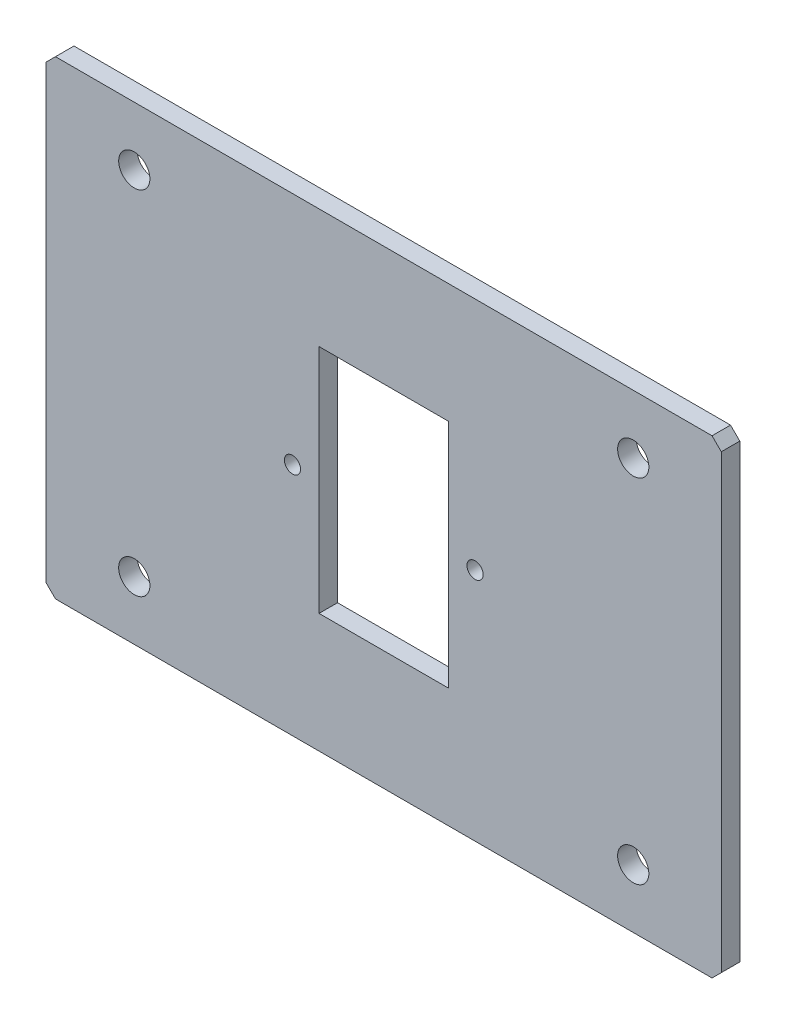
ISO-10303-21;
HEADER;
FILE_DESCRIPTION(('STEP AP214'),'2;1');
FILE_NAME('part.step','',(''),(''),'','','');
FILE_SCHEMA(('AUTOMOTIVE_DESIGN { 1 0 10303 214 1 1 1 1 }'));
ENDSEC;
DATA;
#1=APPLICATION_CONTEXT('core data for automotive mechanical design processes');
#2=APPLICATION_PROTOCOL_DEFINITION('international standard','automotive_design',2000,#1);
#3=PRODUCT_CONTEXT('',#1,'mechanical');
#4=PRODUCT('Part','Part','',(#3));
#5=PRODUCT_RELATED_PRODUCT_CATEGORY('part','',(#4));
#6=PRODUCT_DEFINITION_FORMATION('','',#4);
#7=PRODUCT_DEFINITION_CONTEXT('part definition',#1,'design');
#8=PRODUCT_DEFINITION('design','',#6,#7);
#9=PRODUCT_DEFINITION_SHAPE('','',#8);
#10=(LENGTH_UNIT() NAMED_UNIT(*) SI_UNIT(.MILLI.,.METRE.));
#11=(NAMED_UNIT(*) PLANE_ANGLE_UNIT() SI_UNIT($,.RADIAN.));
#12=(NAMED_UNIT(*) SI_UNIT($,.STERADIAN.) SOLID_ANGLE_UNIT());
#13=UNCERTAINTY_MEASURE_WITH_UNIT(LENGTH_MEASURE(1.E-05),#10,'distance_accuracy_value','');
#14=(GEOMETRIC_REPRESENTATION_CONTEXT(3) GLOBAL_UNCERTAINTY_ASSIGNED_CONTEXT((#13)) GLOBAL_UNIT_ASSIGNED_CONTEXT((#10,
#11,#12)) REPRESENTATION_CONTEXT('',''));
#15=CARTESIAN_POINT('',(0.,0.,0.));
#16=DIRECTION('',(0.,0.,1.));
#17=DIRECTION('',(1.,0.,0.));
#18=AXIS2_PLACEMENT_3D('',#15,#16,#17);
#19=CARTESIAN_POINT('',(0.,-50.8,4.));
#20=DIRECTION('',(0.,1.,0.));
#21=DIRECTION('',(0.,0.,1.));
#22=AXIS2_PLACEMENT_3D('',#19,#20,#21);
#23=PLANE('',#22);
#24=DIRECTION('',(1.,0.,0.));
#25=VECTOR('',#24,1.);
#26=CARTESIAN_POINT('',(0.,-50.8,0.));
#27=LINE('',#26,#25);
#28=CARTESIAN_POINT('',(-71.025,-50.8,0.));
#29=VERTEX_POINT('',#28);
#30=CARTESIAN_POINT('',(71.0249999999999,-50.8,0.));
#31=VERTEX_POINT('',#30);
#32=EDGE_CURVE('E268',#29,#31,#27,.T.);
#33=ORIENTED_EDGE('',*,*,#32,.T.);
#34=DIRECTION('',(0.,0.,1.));
#35=VECTOR('',#34,1.);
#36=CARTESIAN_POINT('',(71.0249999999999,-50.8,4.));
#37=LINE('',#36,#35);
#38=CARTESIAN_POINT('',(71.0249999999999,-50.8,4.));
#39=VERTEX_POINT('',#38);
#40=EDGE_CURVE('E219',#31,#39,#37,.T.);
#41=ORIENTED_EDGE('',*,*,#40,.T.);
#42=DIRECTION('',(1.,0.,0.));
#43=VECTOR('',#42,1.);
#44=CARTESIAN_POINT('',(0.,-50.8,4.));
#45=LINE('',#44,#43);
#46=CARTESIAN_POINT('',(-71.025,-50.8,4.));
#47=VERTEX_POINT('',#46);
#48=EDGE_CURVE('E298',#47,#39,#45,.T.);
#49=ORIENTED_EDGE('',*,*,#48,.F.);
#50=DIRECTION('',(0.,0.,-1.));
#51=VECTOR('',#50,1.);
#52=CARTESIAN_POINT('',(-71.025,-50.8,0.));
#53=LINE('',#52,#51);
#54=EDGE_CURVE('E215',#47,#29,#53,.T.);
#55=ORIENTED_EDGE('',*,*,#54,.T.);
#56=EDGE_LOOP('',(#33,#41,#49,#55));
#57=FACE_BOUND('',#56,.T.);
#58=ADVANCED_FACE('F41',(#57),#23,.F.);
#59=CARTESIAN_POINT('',(73.0249999999999,0.,4.));
#60=DIRECTION('',(-1.,0.,0.));
#61=DIRECTION('',(0.,0.,1.));
#62=AXIS2_PLACEMENT_3D('',#59,#60,#61);
#63=PLANE('',#62);
#64=DIRECTION('',(0.,1.,0.));
#65=VECTOR('',#64,1.);
#66=CARTESIAN_POINT('',(73.0249999999999,0.,0.));
#67=LINE('',#66,#65);
#68=CARTESIAN_POINT('',(73.0249999999999,-48.8,0.));
#69=VERTEX_POINT('',#68);
#70=CARTESIAN_POINT('',(73.0249999999999,48.8,0.));
#71=VERTEX_POINT('',#70);
#72=EDGE_CURVE('E241',#69,#71,#67,.T.);
#73=ORIENTED_EDGE('',*,*,#72,.T.);
#74=DIRECTION('',(0.,0.,1.));
#75=VECTOR('',#74,1.);
#76=CARTESIAN_POINT('',(73.0249999999999,48.8,4.));
#77=LINE('',#76,#75);
#78=CARTESIAN_POINT('',(73.0249999999999,48.8,4.));
#79=VERTEX_POINT('',#78);
#80=EDGE_CURVE('E201',#71,#79,#77,.T.);
#81=ORIENTED_EDGE('',*,*,#80,.T.);
#82=DIRECTION('',(0.,1.,0.));
#83=VECTOR('',#82,1.);
#84=CARTESIAN_POINT('',(73.0249999999999,0.,4.));
#85=LINE('',#84,#83);
#86=CARTESIAN_POINT('',(73.0249999999999,-48.8,4.));
#87=VERTEX_POINT('',#86);
#88=EDGE_CURVE('E289',#87,#79,#85,.T.);
#89=ORIENTED_EDGE('',*,*,#88,.F.);
#90=DIRECTION('',(0.,0.,-1.));
#91=VECTOR('',#90,1.);
#92=CARTESIAN_POINT('',(73.0249999999999,-48.8,4.));
#93=LINE('',#92,#91);
#94=EDGE_CURVE('E197',#87,#69,#93,.T.);
#95=ORIENTED_EDGE('',*,*,#94,.T.);
#96=EDGE_LOOP('',(#73,#81,#89,#95));
#97=FACE_BOUND('',#96,.T.);
#98=ADVANCED_FACE('F279',(#97),#63,.F.);
#99=CARTESIAN_POINT('',(0.,50.8,4.));
#100=DIRECTION('',(0.,1.,0.));
#101=DIRECTION('',(0.,0.,1.));
#102=AXIS2_PLACEMENT_3D('',#99,#100,#101);
#103=PLANE('',#102);
#104=DIRECTION('',(1.,0.,0.));
#105=VECTOR('',#104,1.);
#106=CARTESIAN_POINT('',(0.,50.8,4.));
#107=LINE('',#106,#105);
#108=CARTESIAN_POINT('',(-71.025,50.8,4.));
#109=VERTEX_POINT('',#108);
#110=CARTESIAN_POINT('',(71.025,50.8,4.));
#111=VERTEX_POINT('',#110);
#112=EDGE_CURVE('E288',#109,#111,#107,.T.);
#113=ORIENTED_EDGE('',*,*,#112,.T.);
#114=DIRECTION('',(0.,0.,-1.));
#115=VECTOR('',#114,1.);
#116=CARTESIAN_POINT('',(71.025,50.8,0.));
#117=LINE('',#116,#115);
#118=CARTESIAN_POINT('',(71.025,50.8,0.));
#119=VERTEX_POINT('',#118);
#120=EDGE_CURVE('E165',#111,#119,#117,.T.);
#121=ORIENTED_EDGE('',*,*,#120,.T.);
#122=DIRECTION('',(1.,0.,0.));
#123=VECTOR('',#122,1.);
#124=CARTESIAN_POINT('',(0.,50.8,0.));
#125=LINE('',#124,#123);
#126=CARTESIAN_POINT('',(-71.025,50.8,0.));
#127=VERTEX_POINT('',#126);
#128=EDGE_CURVE('E235',#127,#119,#125,.T.);
#129=ORIENTED_EDGE('',*,*,#128,.F.);
#130=DIRECTION('',(0.,0.,1.));
#131=VECTOR('',#130,1.);
#132=CARTESIAN_POINT('',(-71.025,50.8,4.));
#133=LINE('',#132,#131);
#134=EDGE_CURVE('E161',#127,#109,#133,.T.);
#135=ORIENTED_EDGE('',*,*,#134,.T.);
#136=EDGE_LOOP('',(#113,#121,#129,#135));
#137=FACE_BOUND('',#136,.T.);
#138=ADVANCED_FACE('F291',(#137),#103,.T.);
#139=CARTESIAN_POINT('',(-14.,0.,4.));
#140=DIRECTION('',(-1.,0.,0.));
#141=DIRECTION('',(0.,0.,1.));
#142=AXIS2_PLACEMENT_3D('',#139,#140,#141);
#143=PLANE('',#142);
#144=DIRECTION('',(0.,1.,0.));
#145=VECTOR('',#144,1.);
#146=CARTESIAN_POINT('',(-14.,0.,0.));
#147=LINE('',#146,#145);
#148=CARTESIAN_POINT('',(-14.,-25.,0.));
#149=VERTEX_POINT('',#148);
#150=CARTESIAN_POINT('',(-14.,25.,0.));
#151=VERTEX_POINT('',#150);
#152=EDGE_CURVE('E159',#149,#151,#147,.T.);
#153=ORIENTED_EDGE('',*,*,#152,.T.);
#154=DIRECTION('',(0.,0.,-1.));
#155=VECTOR('',#154,1.);
#156=CARTESIAN_POINT('',(-14.,25.,4.));
#157=LINE('',#156,#155);
#158=CARTESIAN_POINT('',(-14.,25.,4.));
#159=VERTEX_POINT('',#158);
#160=EDGE_CURVE('E137',#159,#151,#157,.T.);
#161=ORIENTED_EDGE('',*,*,#160,.F.);
#162=DIRECTION('',(0.,1.,0.));
#163=VECTOR('',#162,1.);
#164=CARTESIAN_POINT('',(-14.,0.,4.));
#165=LINE('',#164,#163);
#166=CARTESIAN_POINT('',(-14.,-25.,4.));
#167=VERTEX_POINT('',#166);
#168=EDGE_CURVE('E145',#167,#159,#165,.T.);
#169=ORIENTED_EDGE('',*,*,#168,.F.);
#170=DIRECTION('',(0.,0.,-1.));
#171=VECTOR('',#170,1.);
#172=CARTESIAN_POINT('',(-14.,-25.,4.));
#173=LINE('',#172,#171);
#174=EDGE_CURVE('E245',#167,#149,#173,.T.);
#175=ORIENTED_EDGE('',*,*,#174,.T.);
#176=EDGE_LOOP('',(#153,#161,#169,#175));
#177=FACE_BOUND('',#176,.T.);
#178=ADVANCED_FACE('F157',(#177),#143,.F.);
#179=CARTESIAN_POINT('',(0.,25.,4.));
#180=DIRECTION('',(0.,1.,0.));
#181=DIRECTION('',(0.,0.,1.));
#182=AXIS2_PLACEMENT_3D('',#179,#180,#181);
#183=PLANE('',#182);
#184=DIRECTION('',(1.,0.,0.));
#185=VECTOR('',#184,1.);
#186=CARTESIAN_POINT('',(0.,25.,0.));
#187=LINE('',#186,#185);
#188=CARTESIAN_POINT('',(14.,25.,0.));
#189=VERTEX_POINT('',#188);
#190=EDGE_CURVE('E260',#151,#189,#187,.T.);
#191=ORIENTED_EDGE('',*,*,#190,.T.);
#192=DIRECTION('',(0.,0.,-1.));
#193=VECTOR('',#192,1.);
#194=CARTESIAN_POINT('',(14.,25.,4.));
#195=LINE('',#194,#193);
#196=CARTESIAN_POINT('',(14.,25.,4.));
#197=VERTEX_POINT('',#196);
#198=EDGE_CURVE('E139',#197,#189,#195,.T.);
#199=ORIENTED_EDGE('',*,*,#198,.F.);
#200=DIRECTION('',(1.,0.,0.));
#201=VECTOR('',#200,1.);
#202=CARTESIAN_POINT('',(0.,25.,4.));
#203=LINE('',#202,#201);
#204=EDGE_CURVE('E132',#159,#197,#203,.T.);
#205=ORIENTED_EDGE('',*,*,#204,.F.);
#206=ORIENTED_EDGE('',*,*,#160,.T.);
#207=EDGE_LOOP('',(#191,#199,#205,#206));
#208=FACE_BOUND('',#207,.T.);
#209=ADVANCED_FACE('F135',(#208),#183,.F.);
#210=CARTESIAN_POINT('',(14.,0.,4.));
#211=DIRECTION('',(-1.,0.,0.));
#212=DIRECTION('',(0.,0.,1.));
#213=AXIS2_PLACEMENT_3D('',#210,#211,#212);
#214=PLANE('',#213);
#215=DIRECTION('',(0.,1.,0.));
#216=VECTOR('',#215,1.);
#217=CARTESIAN_POINT('',(14.,0.,0.));
#218=LINE('',#217,#216);
#219=CARTESIAN_POINT('',(14.,-25.,0.));
#220=VERTEX_POINT('',#219);
#221=EDGE_CURVE('E256',#220,#189,#218,.T.);
#222=ORIENTED_EDGE('',*,*,#221,.F.);
#223=DIRECTION('',(0.,0.,-1.));
#224=VECTOR('',#223,1.);
#225=CARTESIAN_POINT('',(14.,-25.,4.));
#226=LINE('',#225,#224);
#227=CARTESIAN_POINT('',(14.,-25.,4.));
#228=VERTEX_POINT('',#227);
#229=EDGE_CURVE('E167',#228,#220,#226,.T.);
#230=ORIENTED_EDGE('',*,*,#229,.F.);
#231=DIRECTION('',(0.,1.,0.));
#232=VECTOR('',#231,1.);
#233=CARTESIAN_POINT('',(14.,0.,4.));
#234=LINE('',#233,#232);
#235=EDGE_CURVE('E144',#228,#197,#234,.T.);
#236=ORIENTED_EDGE('',*,*,#235,.T.);
#237=ORIENTED_EDGE('',*,*,#198,.T.);
#238=EDGE_LOOP('',(#222,#230,#236,#237));
#239=FACE_BOUND('',#238,.T.);
#240=ADVANCED_FACE('F257',(#239),#214,.T.);
#241=CARTESIAN_POINT('',(-19.75,0.,4.));
#242=DIRECTION('',(0.,0.,-1.));
#243=DIRECTION('',(-1.,0.,0.));
#244=AXIS2_PLACEMENT_3D('',#241,#242,#243);
#245=CYLINDRICAL_SURFACE('',#244,1.75);
#246=CARTESIAN_POINT('',(-19.75,0.,4.));
#247=DIRECTION('',(0.,0.,1.));
#248=DIRECTION('',(1.,0.,0.));
#249=AXIS2_PLACEMENT_3D('',#246,#247,#248);
#250=CIRCLE('',#249,1.75);
#251=CARTESIAN_POINT('',(-18.,0.,4.));
#252=VERTEX_POINT('',#251);
#253=EDGE_CURVE('E336',#252,#252,#250,.T.);
#254=ORIENTED_EDGE('',*,*,#253,.T.);
#255=EDGE_LOOP('',(#254));
#256=FACE_BOUND('',#255,.T.);
#257=CARTESIAN_POINT('',(-19.75,0.,0.));
#258=DIRECTION('',(0.,0.,1.));
#259=DIRECTION('',(1.,0.,0.));
#260=AXIS2_PLACEMENT_3D('',#257,#258,#259);
#261=CIRCLE('',#260,1.75);
#262=CARTESIAN_POINT('',(-18.,0.,0.));
#263=VERTEX_POINT('',#262);
#264=EDGE_CURVE('E264',#263,#263,#261,.T.);
#265=ORIENTED_EDGE('',*,*,#264,.F.);
#266=EDGE_LOOP('',(#265));
#267=FACE_BOUND('',#266,.T.);
#268=ADVANCED_FACE('F366',(#256,#267),#245,.F.);
#269=CARTESIAN_POINT('',(0.,-25.,4.));
#270=DIRECTION('',(0.,1.,0.));
#271=DIRECTION('',(0.,0.,1.));
#272=AXIS2_PLACEMENT_3D('',#269,#270,#271);
#273=PLANE('',#272);
#274=DIRECTION('',(1.,0.,0.));
#275=VECTOR('',#274,1.);
#276=CARTESIAN_POINT('',(0.,-25.,0.));
#277=LINE('',#276,#275);
#278=EDGE_CURVE('E253',#149,#220,#277,.T.);
#279=ORIENTED_EDGE('',*,*,#278,.F.);
#280=ORIENTED_EDGE('',*,*,#174,.F.);
#281=DIRECTION('',(1.,0.,0.));
#282=VECTOR('',#281,1.);
#283=CARTESIAN_POINT('',(0.,-25.,4.));
#284=LINE('',#283,#282);
#285=EDGE_CURVE('E152',#167,#228,#284,.T.);
#286=ORIENTED_EDGE('',*,*,#285,.T.);
#287=ORIENTED_EDGE('',*,*,#229,.T.);
#288=EDGE_LOOP('',(#279,#280,#286,#287));
#289=FACE_BOUND('',#288,.T.);
#290=ADVANCED_FACE('F251',(#289),#273,.T.);
#291=CARTESIAN_POINT('',(19.75,0.,4.));
#292=DIRECTION('',(0.,0.,-1.));
#293=DIRECTION('',(-1.,0.,0.));
#294=AXIS2_PLACEMENT_3D('',#291,#292,#293);
#295=CYLINDRICAL_SURFACE('',#294,1.75);
#296=CARTESIAN_POINT('',(19.75,0.,4.));
#297=DIRECTION('',(0.,0.,1.));
#298=DIRECTION('',(1.,0.,0.));
#299=AXIS2_PLACEMENT_3D('',#296,#297,#298);
#300=CIRCLE('',#299,1.75);
#301=CARTESIAN_POINT('',(21.5,0.,4.));
#302=VERTEX_POINT('',#301);
#303=EDGE_CURVE('E155',#302,#302,#300,.T.);
#304=ORIENTED_EDGE('',*,*,#303,.T.);
#305=EDGE_LOOP('',(#304));
#306=FACE_BOUND('',#305,.T.);
#307=CARTESIAN_POINT('',(19.75,0.,0.));
#308=DIRECTION('',(0.,0.,1.));
#309=DIRECTION('',(1.,0.,0.));
#310=AXIS2_PLACEMENT_3D('',#307,#308,#309);
#311=CIRCLE('',#310,1.75);
#312=CARTESIAN_POINT('',(21.5,0.,0.));
#313=VERTEX_POINT('',#312);
#314=EDGE_CURVE('E302',#313,#313,#311,.T.);
#315=ORIENTED_EDGE('',*,*,#314,.F.);
#316=EDGE_LOOP('',(#315));
#317=FACE_BOUND('',#316,.T.);
#318=ADVANCED_FACE('F372',(#306,#317),#295,.F.);
#319=CARTESIAN_POINT('',(-73.025,0.,4.));
#320=DIRECTION('',(-1.,0.,0.));
#321=DIRECTION('',(0.,0.,1.));
#322=AXIS2_PLACEMENT_3D('',#319,#320,#321);
#323=PLANE('',#322);
#324=DIRECTION('',(0.,1.,0.));
#325=VECTOR('',#324,1.);
#326=CARTESIAN_POINT('',(-73.025,0.,0.));
#327=LINE('',#326,#325);
#328=CARTESIAN_POINT('',(-73.025,-48.8,0.));
#329=VERTEX_POINT('',#328);
#330=CARTESIAN_POINT('',(-73.025,48.8,0.));
#331=VERTEX_POINT('',#330);
#332=EDGE_CURVE('E226',#329,#331,#327,.T.);
#333=ORIENTED_EDGE('',*,*,#332,.F.);
#334=DIRECTION('',(0.,0.,1.));
#335=VECTOR('',#334,1.);
#336=CARTESIAN_POINT('',(-73.025,-48.8,4.));
#337=LINE('',#336,#335);
#338=CARTESIAN_POINT('',(-73.025,-48.8,4.));
#339=VERTEX_POINT('',#338);
#340=EDGE_CURVE('E11',#329,#339,#337,.T.);
#341=ORIENTED_EDGE('',*,*,#340,.T.);
#342=DIRECTION('',(0.,1.,0.));
#343=VECTOR('',#342,1.);
#344=CARTESIAN_POINT('',(-73.025,0.,4.));
#345=LINE('',#344,#343);
#346=CARTESIAN_POINT('',(-73.025,48.8,4.));
#347=VERTEX_POINT('',#346);
#348=EDGE_CURVE('E227',#339,#347,#345,.T.);
#349=ORIENTED_EDGE('',*,*,#348,.T.);
#350=DIRECTION('',(0.,0.,-1.));
#351=VECTOR('',#350,1.);
#352=CARTESIAN_POINT('',(-73.025,48.8,4.));
#353=LINE('',#352,#351);
#354=EDGE_CURVE('E51',#347,#331,#353,.T.);
#355=ORIENTED_EDGE('',*,*,#354,.T.);
#356=EDGE_LOOP('',(#333,#341,#349,#355));
#357=FACE_BOUND('',#356,.T.);
#358=ADVANCED_FACE('F225',(#357),#323,.T.);
#359=CARTESIAN_POINT('',(0.,0.,4.));
#360=DIRECTION('',(0.,0.,1.));
#361=DIRECTION('',(1.,0.,0.));
#362=AXIS2_PLACEMENT_3D('',#359,#360,#361);
#363=PLANE('',#362);
#364=CARTESIAN_POINT('',(-53.975,38.1,4.));
#365=DIRECTION('',(0.,0.,1.));
#366=DIRECTION('',(1.,0.,0.));
#367=AXIS2_PLACEMENT_3D('',#364,#365,#366);
#368=CIRCLE('',#367,3.37819999999999);
#369=CARTESIAN_POINT('',(-50.5968,38.1,4.));
#370=VERTEX_POINT('',#369);
#371=EDGE_CURVE('E325',#370,#370,#368,.T.);
#372=ORIENTED_EDGE('',*,*,#371,.F.);
#373=EDGE_LOOP('',(#372));
#374=FACE_BOUND('',#373,.T.);
#375=CARTESIAN_POINT('',(53.9749999999999,38.1,4.));
#376=DIRECTION('',(0.,0.,1.));
#377=DIRECTION('',(1.,0.,0.));
#378=AXIS2_PLACEMENT_3D('',#375,#376,#377);
#379=CIRCLE('',#378,3.37819999999999);
#380=CARTESIAN_POINT('',(57.3531999999999,38.1,4.));
#381=VERTEX_POINT('',#380);
#382=EDGE_CURVE('E180',#381,#381,#379,.T.);
#383=ORIENTED_EDGE('',*,*,#382,.F.);
#384=EDGE_LOOP('',(#383));
#385=FACE_BOUND('',#384,.T.);
#386=CARTESIAN_POINT('',(53.9749999999999,-38.1,4.));
#387=DIRECTION('',(0.,0.,1.));
#388=DIRECTION('',(1.,0.,0.));
#389=AXIS2_PLACEMENT_3D('',#386,#387,#388);
#390=CIRCLE('',#389,3.37819999999999);
#391=CARTESIAN_POINT('',(57.3531999999999,-38.1,4.));
#392=VERTEX_POINT('',#391);
#393=EDGE_CURVE('E176',#392,#392,#390,.T.);
#394=ORIENTED_EDGE('',*,*,#393,.F.);
#395=EDGE_LOOP('',(#394));
#396=FACE_BOUND('',#395,.T.);
#397=CARTESIAN_POINT('',(-53.975,-38.1,4.));
#398=DIRECTION('',(0.,0.,1.));
#399=DIRECTION('',(1.,0.,0.));
#400=AXIS2_PLACEMENT_3D('',#397,#398,#399);
#401=CIRCLE('',#400,3.37819999999999);
#402=CARTESIAN_POINT('',(-50.5968,-38.1,4.));
#403=VERTEX_POINT('',#402);
#404=EDGE_CURVE('E175',#403,#403,#401,.T.);
#405=ORIENTED_EDGE('',*,*,#404,.F.);
#406=EDGE_LOOP('',(#405));
#407=FACE_BOUND('',#406,.T.);
#408=ORIENTED_EDGE('',*,*,#303,.F.);
#409=EDGE_LOOP('',(#408));
#410=FACE_BOUND('',#409,.T.);
#411=ORIENTED_EDGE('',*,*,#168,.T.);
#412=ORIENTED_EDGE('',*,*,#204,.T.);
#413=ORIENTED_EDGE('',*,*,#235,.F.);
#414=ORIENTED_EDGE('',*,*,#285,.F.);
#415=EDGE_LOOP('',(#411,#412,#413,#414));
#416=FACE_BOUND('',#415,.T.);
#417=ORIENTED_EDGE('',*,*,#253,.F.);
#418=EDGE_LOOP('',(#417));
#419=FACE_BOUND('',#418,.T.);
#420=ORIENTED_EDGE('',*,*,#88,.T.);
#421=DIRECTION('',(-0.707106781186543,0.707106781186552,0.));
#422=VECTOR('',#421,1.);
#423=CARTESIAN_POINT('',(60.9125000000005,60.9124999999996,4.));
#424=LINE('',#423,#422);
#425=EDGE_CURVE('E212',#79,#111,#424,.T.);
#426=ORIENTED_EDGE('',*,*,#425,.T.);
#427=ORIENTED_EDGE('',*,*,#112,.F.);
#428=DIRECTION('',(0.707106781186548,0.707106781186548,0.));
#429=VECTOR('',#428,1.);
#430=CARTESIAN_POINT('',(-60.9125,60.9125,4.));
#431=LINE('',#430,#429);
#432=EDGE_CURVE('E58',#109,#347,#431,.F.);
#433=ORIENTED_EDGE('',*,*,#432,.T.);
#434=ORIENTED_EDGE('',*,*,#348,.F.);
#435=DIRECTION('',(0.707106781186543,-0.707106781186552,0.));
#436=VECTOR('',#435,1.);
#437=CARTESIAN_POINT('',(-60.9125000000005,-60.9124999999997,4.));
#438=LINE('',#437,#436);
#439=EDGE_CURVE('E206',#339,#47,#438,.T.);
#440=ORIENTED_EDGE('',*,*,#439,.T.);
#441=ORIENTED_EDGE('',*,*,#48,.T.);
#442=DIRECTION('',(-0.707106781186548,-0.707106781186548,0.));
#443=VECTOR('',#442,1.);
#444=CARTESIAN_POINT('',(60.9125,-60.9125,4.));
#445=LINE('',#444,#443);
#446=EDGE_CURVE('E209',#39,#87,#445,.F.);
#447=ORIENTED_EDGE('',*,*,#446,.T.);
#448=EDGE_LOOP('',(#420,#426,#427,#433,#434,#440,#441,#447));
#449=FACE_BOUND('',#448,.T.);
#450=ADVANCED_FACE('F149',(#374,#385,#396,#407,#410,#416,#419,#449),#363,.T.);
#451=CARTESIAN_POINT('',(0.,0.,0.));
#452=DIRECTION('',(0.,0.,1.));
#453=DIRECTION('',(1.,0.,0.));
#454=AXIS2_PLACEMENT_3D('',#451,#452,#453);
#455=PLANE('',#454);
#456=CARTESIAN_POINT('',(-53.975,38.1,0.));
#457=DIRECTION('',(0.,0.,1.));
#458=DIRECTION('',(1.,0.,0.));
#459=AXIS2_PLACEMENT_3D('',#456,#457,#458);
#460=CIRCLE('',#459,3.37819999999999);
#461=CARTESIAN_POINT('',(-50.5968,38.1,0.));
#462=VERTEX_POINT('',#461);
#463=EDGE_CURVE('E321',#462,#462,#460,.T.);
#464=ORIENTED_EDGE('',*,*,#463,.T.);
#465=EDGE_LOOP('',(#464));
#466=FACE_BOUND('',#465,.T.);
#467=CARTESIAN_POINT('',(53.9749999999999,38.1,0.));
#468=DIRECTION('',(0.,0.,1.));
#469=DIRECTION('',(1.,0.,0.));
#470=AXIS2_PLACEMENT_3D('',#467,#468,#469);
#471=CIRCLE('',#470,3.37819999999999);
#472=CARTESIAN_POINT('',(57.3531999999999,38.1,0.));
#473=VERTEX_POINT('',#472);
#474=EDGE_CURVE('E177',#473,#473,#471,.T.);
#475=ORIENTED_EDGE('',*,*,#474,.T.);
#476=EDGE_LOOP('',(#475));
#477=FACE_BOUND('',#476,.T.);
#478=CARTESIAN_POINT('',(53.9749999999999,-38.1,0.));
#479=DIRECTION('',(0.,0.,1.));
#480=DIRECTION('',(1.,0.,0.));
#481=AXIS2_PLACEMENT_3D('',#478,#479,#480);
#482=CIRCLE('',#481,3.37819999999999);
#483=CARTESIAN_POINT('',(57.3531999999999,-38.1,0.));
#484=VERTEX_POINT('',#483);
#485=EDGE_CURVE('E171',#484,#484,#482,.T.);
#486=ORIENTED_EDGE('',*,*,#485,.T.);
#487=EDGE_LOOP('',(#486));
#488=FACE_BOUND('',#487,.T.);
#489=CARTESIAN_POINT('',(-53.975,-38.1,0.));
#490=DIRECTION('',(0.,0.,1.));
#491=DIRECTION('',(1.,0.,0.));
#492=AXIS2_PLACEMENT_3D('',#489,#490,#491);
#493=CIRCLE('',#492,3.37819999999999);
#494=CARTESIAN_POINT('',(-50.5968,-38.1,0.));
#495=VERTEX_POINT('',#494);
#496=EDGE_CURVE('E306',#495,#495,#493,.T.);
#497=ORIENTED_EDGE('',*,*,#496,.T.);
#498=EDGE_LOOP('',(#497));
#499=FACE_BOUND('',#498,.T.);
#500=ORIENTED_EDGE('',*,*,#314,.T.);
#501=EDGE_LOOP('',(#500));
#502=FACE_BOUND('',#501,.T.);
#503=ORIENTED_EDGE('',*,*,#152,.F.);
#504=ORIENTED_EDGE('',*,*,#278,.T.);
#505=ORIENTED_EDGE('',*,*,#221,.T.);
#506=ORIENTED_EDGE('',*,*,#190,.F.);
#507=EDGE_LOOP('',(#503,#504,#505,#506));
#508=FACE_BOUND('',#507,.T.);
#509=ORIENTED_EDGE('',*,*,#264,.T.);
#510=EDGE_LOOP('',(#509));
#511=FACE_BOUND('',#510,.T.);
#512=ORIENTED_EDGE('',*,*,#128,.T.);
#513=DIRECTION('',(0.707106781186543,-0.707106781186552,0.));
#514=VECTOR('',#513,1.);
#515=CARTESIAN_POINT('',(71.025,50.8,0.));
#516=LINE('',#515,#514);
#517=EDGE_CURVE('E194',#119,#71,#516,.T.);
#518=ORIENTED_EDGE('',*,*,#517,.T.);
#519=ORIENTED_EDGE('',*,*,#72,.F.);
#520=DIRECTION('',(0.707106781186548,0.707106781186548,0.));
#521=VECTOR('',#520,1.);
#522=CARTESIAN_POINT('',(73.0249999999999,-48.8,0.));
#523=LINE('',#522,#521);
#524=EDGE_CURVE('E191',#69,#31,#523,.F.);
#525=ORIENTED_EDGE('',*,*,#524,.T.);
#526=ORIENTED_EDGE('',*,*,#32,.F.);
#527=DIRECTION('',(-0.707106781186543,0.707106781186552,0.));
#528=VECTOR('',#527,1.);
#529=CARTESIAN_POINT('',(-71.025,-50.8,0.));
#530=LINE('',#529,#528);
#531=EDGE_CURVE('E188',#29,#329,#530,.T.);
#532=ORIENTED_EDGE('',*,*,#531,.T.);
#533=ORIENTED_EDGE('',*,*,#332,.T.);
#534=DIRECTION('',(-0.707106781186548,-0.707106781186548,0.));
#535=VECTOR('',#534,1.);
#536=CARTESIAN_POINT('',(-73.025,48.8,0.));
#537=LINE('',#536,#535);
#538=EDGE_CURVE('E185',#331,#127,#537,.F.);
#539=ORIENTED_EDGE('',*,*,#538,.T.);
#540=EDGE_LOOP('',(#512,#518,#519,#525,#526,#532,#533,#539));
#541=FACE_BOUND('',#540,.T.);
#542=ADVANCED_FACE('F231',(#466,#477,#488,#499,#502,#508,#511,#541),#455,.F.);
#543=CARTESIAN_POINT('',(-53.975,-38.1,4.));
#544=DIRECTION('',(0.,0.,1.));
#545=DIRECTION('',(1.,0.,0.));
#546=AXIS2_PLACEMENT_3D('',#543,#544,#545);
#547=CYLINDRICAL_SURFACE('',#546,3.37819999999999);
#548=ORIENTED_EDGE('',*,*,#404,.T.);
#549=EDGE_LOOP('',(#548));
#550=FACE_BOUND('',#549,.T.);
#551=ORIENTED_EDGE('',*,*,#496,.F.);
#552=EDGE_LOOP('',(#551));
#553=FACE_BOUND('',#552,.T.);
#554=ADVANCED_FACE('F409',(#550,#553),#547,.F.);
#555=CARTESIAN_POINT('',(53.9749999999999,-38.1,4.));
#556=DIRECTION('',(0.,0.,1.));
#557=DIRECTION('',(1.,0.,0.));
#558=AXIS2_PLACEMENT_3D('',#555,#556,#557);
#559=CYLINDRICAL_SURFACE('',#558,3.37819999999999);
#560=ORIENTED_EDGE('',*,*,#393,.T.);
#561=EDGE_LOOP('',(#560));
#562=FACE_BOUND('',#561,.T.);
#563=ORIENTED_EDGE('',*,*,#485,.F.);
#564=EDGE_LOOP('',(#563));
#565=FACE_BOUND('',#564,.T.);
#566=ADVANCED_FACE('F402',(#562,#565),#559,.F.);
#567=CARTESIAN_POINT('',(53.9749999999999,38.1,4.));
#568=DIRECTION('',(0.,0.,1.));
#569=DIRECTION('',(1.,0.,0.));
#570=AXIS2_PLACEMENT_3D('',#567,#568,#569);
#571=CYLINDRICAL_SURFACE('',#570,3.37819999999999);
#572=ORIENTED_EDGE('',*,*,#382,.T.);
#573=EDGE_LOOP('',(#572));
#574=FACE_BOUND('',#573,.T.);
#575=ORIENTED_EDGE('',*,*,#474,.F.);
#576=EDGE_LOOP('',(#575));
#577=FACE_BOUND('',#576,.T.);
#578=ADVANCED_FACE('F397',(#574,#577),#571,.F.);
#579=CARTESIAN_POINT('',(-53.975,38.1,4.));
#580=DIRECTION('',(0.,0.,1.));
#581=DIRECTION('',(1.,0.,0.));
#582=AXIS2_PLACEMENT_3D('',#579,#580,#581);
#583=CYLINDRICAL_SURFACE('',#582,3.37819999999999);
#584=ORIENTED_EDGE('',*,*,#371,.T.);
#585=EDGE_LOOP('',(#584));
#586=FACE_BOUND('',#585,.T.);
#587=ORIENTED_EDGE('',*,*,#463,.F.);
#588=EDGE_LOOP('',(#587));
#589=FACE_BOUND('',#588,.T.);
#590=ADVANCED_FACE('F387',(#586,#589),#583,.F.);
#591=CARTESIAN_POINT('',(71.025,50.8,4.));
#592=DIRECTION('',(0.707106781186552,0.707106781186543,0.));
#593=DIRECTION('',(0.,0.,1.));
#594=AXIS2_PLACEMENT_3D('',#591,#592,#593);
#595=PLANE('',#594);
#596=ORIENTED_EDGE('',*,*,#425,.F.);
#597=ORIENTED_EDGE('',*,*,#80,.F.);
#598=ORIENTED_EDGE('',*,*,#517,.F.);
#599=ORIENTED_EDGE('',*,*,#120,.F.);
#600=EDGE_LOOP('',(#596,#597,#598,#599));
#601=FACE_BOUND('',#600,.T.);
#602=ADVANCED_FACE('F285',(#601),#595,.T.);
#603=CARTESIAN_POINT('',(73.0249999999999,-48.8,4.));
#604=DIRECTION('',(-0.707106781186547,0.707106781186547,0.));
#605=DIRECTION('',(0.,0.,-1.));
#606=AXIS2_PLACEMENT_3D('',#603,#604,#605);
#607=PLANE('',#606);
#608=ORIENTED_EDGE('',*,*,#446,.F.);
#609=ORIENTED_EDGE('',*,*,#40,.F.);
#610=ORIENTED_EDGE('',*,*,#524,.F.);
#611=ORIENTED_EDGE('',*,*,#94,.F.);
#612=EDGE_LOOP('',(#608,#609,#610,#611));
#613=FACE_BOUND('',#612,.T.);
#614=ADVANCED_FACE('F348',(#613),#607,.F.);
#615=CARTESIAN_POINT('',(-71.025,-50.8,4.));
#616=DIRECTION('',(-0.707106781186552,-0.707106781186543,0.));
#617=DIRECTION('',(0.,0.,1.));
#618=AXIS2_PLACEMENT_3D('',#615,#616,#617);
#619=PLANE('',#618);
#620=ORIENTED_EDGE('',*,*,#439,.F.);
#621=ORIENTED_EDGE('',*,*,#340,.F.);
#622=ORIENTED_EDGE('',*,*,#531,.F.);
#623=ORIENTED_EDGE('',*,*,#54,.F.);
#624=EDGE_LOOP('',(#620,#621,#622,#623));
#625=FACE_BOUND('',#624,.T.);
#626=ADVANCED_FACE('F350',(#625),#619,.T.);
#627=CARTESIAN_POINT('',(-73.025,48.8,4.));
#628=DIRECTION('',(0.707106781186547,-0.707106781186547,0.));
#629=DIRECTION('',(0.,0.,-1.));
#630=AXIS2_PLACEMENT_3D('',#627,#628,#629);
#631=PLANE('',#630);
#632=ORIENTED_EDGE('',*,*,#432,.F.);
#633=ORIENTED_EDGE('',*,*,#134,.F.);
#634=ORIENTED_EDGE('',*,*,#538,.F.);
#635=ORIENTED_EDGE('',*,*,#354,.F.);
#636=EDGE_LOOP('',(#632,#633,#634,#635));
#637=FACE_BOUND('',#636,.T.);
#638=ADVANCED_FACE('F44',(#637),#631,.F.);
#639=CLOSED_SHELL('',(#58,#98,#138,#178,#209,#240,#268,#290,#318,#358,#450,#542,#554,#566,#578,
#590,#602,#614,#626,#638));
#640=MANIFOLD_SOLID_BREP('B2',#639);
#641=ADVANCED_BREP_SHAPE_REPRESENTATION('',(#18,#640),#14);
#642=SHAPE_DEFINITION_REPRESENTATION(#9,#641);
ENDSEC;
END-ISO-10303-21;
